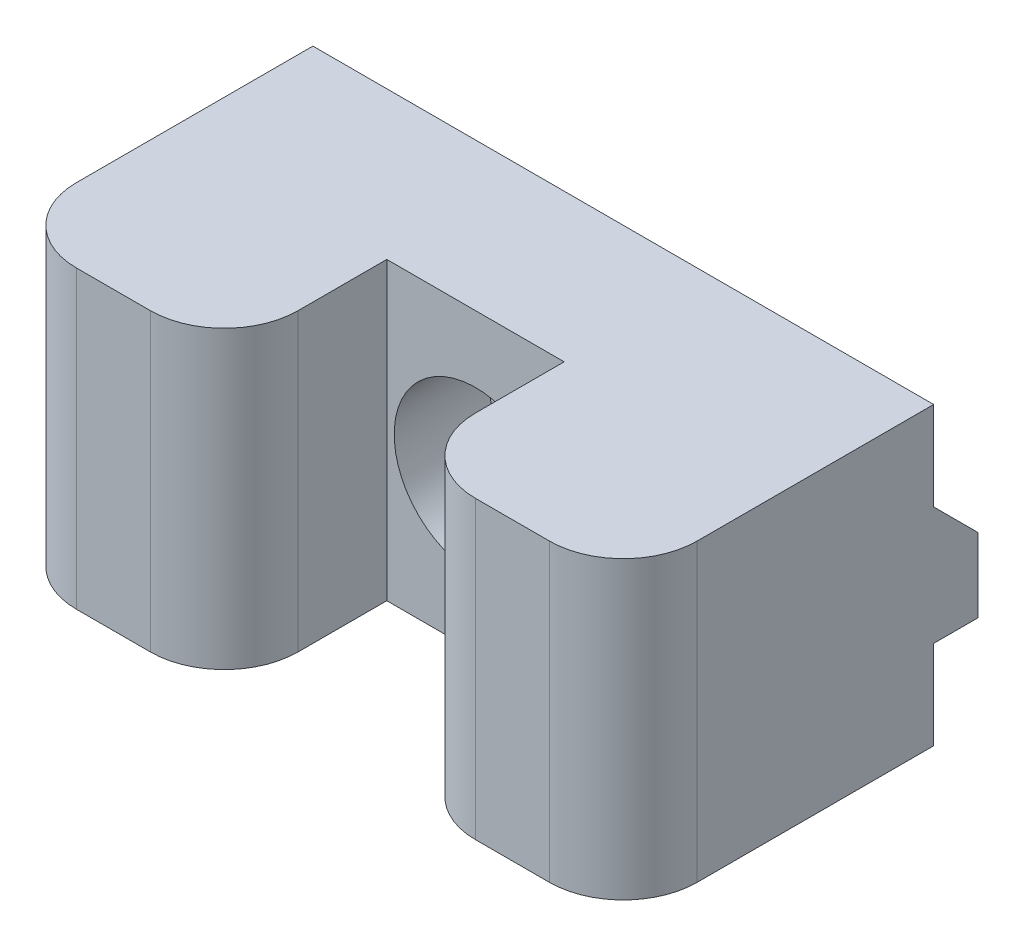
ISO-10303-21;
HEADER;
FILE_DESCRIPTION(('STEP AP214'),'2;1');
FILE_NAME('part.step','',(''),(''),'','','');
FILE_SCHEMA(('AUTOMOTIVE_DESIGN { 1 0 10303 214 1 1 1 1 }'));
ENDSEC;
DATA;
#1=APPLICATION_CONTEXT('core data for automotive mechanical design processes');
#2=APPLICATION_PROTOCOL_DEFINITION('international standard','automotive_design',2000,#1);
#3=PRODUCT_CONTEXT('',#1,'mechanical');
#4=PRODUCT('Part','Part','',(#3));
#5=PRODUCT_RELATED_PRODUCT_CATEGORY('part','',(#4));
#6=PRODUCT_DEFINITION_FORMATION('','',#4);
#7=PRODUCT_DEFINITION_CONTEXT('part definition',#1,'design');
#8=PRODUCT_DEFINITION('design','',#6,#7);
#9=PRODUCT_DEFINITION_SHAPE('','',#8);
#10=(LENGTH_UNIT() NAMED_UNIT(*) SI_UNIT(.MILLI.,.METRE.));
#11=(NAMED_UNIT(*) PLANE_ANGLE_UNIT() SI_UNIT($,.RADIAN.));
#12=(NAMED_UNIT(*) SI_UNIT($,.STERADIAN.) SOLID_ANGLE_UNIT());
#13=UNCERTAINTY_MEASURE_WITH_UNIT(LENGTH_MEASURE(1.E-05),#10,'distance_accuracy_value','');
#14=(GEOMETRIC_REPRESENTATION_CONTEXT(3) GLOBAL_UNCERTAINTY_ASSIGNED_CONTEXT((#13)) GLOBAL_UNIT_ASSIGNED_CONTEXT((#10,
#11,#12)) REPRESENTATION_CONTEXT('',''));
#15=CARTESIAN_POINT('',(0.,0.,0.));
#16=DIRECTION('',(0.,0.,1.));
#17=DIRECTION('',(1.,0.,0.));
#18=AXIS2_PLACEMENT_3D('',#15,#16,#17);
#19=CARTESIAN_POINT('',(0.,0.,0.));
#20=DIRECTION('',(0.,0.,1.));
#21=DIRECTION('',(1.,0.,0.));
#22=AXIS2_PLACEMENT_3D('',#19,#20,#21);
#23=PLANE('',#22);
#24=CARTESIAN_POINT('',(0.,0.,0.));
#25=DIRECTION('',(0.,0.,1.));
#26=DIRECTION('',(1.,0.,0.));
#27=AXIS2_PLACEMENT_3D('',#24,#25,#26);
#28=CIRCLE('',#27,3.3);
#29=CARTESIAN_POINT('',(3.3,0.,0.));
#30=VERTEX_POINT('',#29);
#31=EDGE_CURVE('E240',#30,#30,#28,.T.);
#32=ORIENTED_EDGE('',*,*,#31,.T.);
#33=EDGE_LOOP('',(#32));
#34=FACE_BOUND('',#33,.T.);
#35=DIRECTION('',(-1.,0.,0.));
#36=VECTOR('',#35,1.);
#37=CARTESIAN_POINT('',(0.,-4.,0.));
#38=LINE('',#37,#36);
#39=CARTESIAN_POINT('',(-8.06225774829855,-4.,0.));
#40=VERTEX_POINT('',#39);
#41=CARTESIAN_POINT('',(-21.,-4.,0.));
#42=VERTEX_POINT('',#41);
#43=EDGE_CURVE('E205',#40,#42,#38,.T.);
#44=ORIENTED_EDGE('',*,*,#43,.F.);
#45=CARTESIAN_POINT('',(0.,0.,0.));
#46=DIRECTION('',(0.,0.,-1.));
#47=DIRECTION('',(-1.,0.,0.));
#48=AXIS2_PLACEMENT_3D('',#45,#46,#47);
#49=CIRCLE('',#48,9.);
#50=CARTESIAN_POINT('',(-8.06225774829855,4.,0.));
#51=VERTEX_POINT('',#50);
#52=EDGE_CURVE('E184',#40,#51,#49,.T.);
#53=ORIENTED_EDGE('',*,*,#52,.T.);
#54=DIRECTION('',(-1.,0.,0.));
#55=VECTOR('',#54,1.);
#56=CARTESIAN_POINT('',(0.,4.,0.));
#57=LINE('',#56,#55);
#58=CARTESIAN_POINT('',(-21.,4.,0.));
#59=VERTEX_POINT('',#58);
#60=EDGE_CURVE('E202',#51,#59,#57,.T.);
#61=ORIENTED_EDGE('',*,*,#60,.T.);
#62=DIRECTION('',(0.,-1.,0.));
#63=VECTOR('',#62,1.);
#64=CARTESIAN_POINT('',(-21.,10.,0.));
#65=LINE('',#64,#63);
#66=CARTESIAN_POINT('',(-21.,10.,0.));
#67=VERTEX_POINT('',#66);
#68=EDGE_CURVE('E298',#67,#59,#65,.T.);
#69=ORIENTED_EDGE('',*,*,#68,.F.);
#70=DIRECTION('',(-1.,0.,0.));
#71=VECTOR('',#70,1.);
#72=CARTESIAN_POINT('',(-21.,10.,0.));
#73=LINE('',#72,#71);
#74=CARTESIAN_POINT('',(21.,10.,0.));
#75=VERTEX_POINT('',#74);
#76=EDGE_CURVE('E294',#75,#67,#73,.T.);
#77=ORIENTED_EDGE('',*,*,#76,.F.);
#78=DIRECTION('',(0.,1.,0.));
#79=VECTOR('',#78,1.);
#80=CARTESIAN_POINT('',(21.,10.,0.));
#81=LINE('',#80,#79);
#82=CARTESIAN_POINT('',(21.,4.,0.));
#83=VERTEX_POINT('',#82);
#84=EDGE_CURVE('E283',#83,#75,#81,.T.);
#85=ORIENTED_EDGE('',*,*,#84,.F.);
#86=DIRECTION('',(-1.,0.,0.));
#87=VECTOR('',#86,1.);
#88=CARTESIAN_POINT('',(0.,4.,0.));
#89=LINE('',#88,#87);
#90=CARTESIAN_POINT('',(8.06225774829855,4.,0.));
#91=VERTEX_POINT('',#90);
#92=EDGE_CURVE('E223',#83,#91,#89,.T.);
#93=ORIENTED_EDGE('',*,*,#92,.T.);
#94=CARTESIAN_POINT('',(0.,0.,0.));
#95=DIRECTION('',(0.,0.,-1.));
#96=DIRECTION('',(-1.,0.,0.));
#97=AXIS2_PLACEMENT_3D('',#94,#95,#96);
#98=CIRCLE('',#97,9.);
#99=CARTESIAN_POINT('',(8.06225774829855,-4.,0.));
#100=VERTEX_POINT('',#99);
#101=EDGE_CURVE('E188',#91,#100,#98,.T.);
#102=ORIENTED_EDGE('',*,*,#101,.T.);
#103=DIRECTION('',(-1.,0.,0.));
#104=VECTOR('',#103,1.);
#105=CARTESIAN_POINT('',(0.,-4.,0.));
#106=LINE('',#105,#104);
#107=CARTESIAN_POINT('',(21.,-4.,0.));
#108=VERTEX_POINT('',#107);
#109=EDGE_CURVE('E215',#108,#100,#106,.T.);
#110=ORIENTED_EDGE('',*,*,#109,.F.);
#111=CARTESIAN_POINT('',(21.,-10.,0.));
#112=VERTEX_POINT('',#111);
#113=EDGE_CURVE('E291',#112,#108,#81,.T.);
#114=ORIENTED_EDGE('',*,*,#113,.F.);
#115=DIRECTION('',(1.,0.,0.));
#116=VECTOR('',#115,1.);
#117=CARTESIAN_POINT('',(-21.,-10.,0.));
#118=LINE('',#117,#116);
#119=CARTESIAN_POINT('',(-21.,-10.,0.));
#120=VERTEX_POINT('',#119);
#121=EDGE_CURVE('E288',#120,#112,#118,.T.);
#122=ORIENTED_EDGE('',*,*,#121,.F.);
#123=EDGE_CURVE('E297',#42,#120,#65,.T.);
#124=ORIENTED_EDGE('',*,*,#123,.F.);
#125=EDGE_LOOP('',(#44,#53,#61,#69,#77,#85,#93,#102,#110,#114,#122,#124));
#126=FACE_BOUND('',#125,.T.);
#127=ADVANCED_FACE('F41',(#34,#126),#23,.F.);
#128=CARTESIAN_POINT('',(-21.,-10.,10.));
#129=DIRECTION('',(0.,1.,0.));
#130=DIRECTION('',(0.,0.,1.));
#131=AXIS2_PLACEMENT_3D('',#128,#129,#130);
#132=PLANE('',#131);
#133=DIRECTION('',(0.,0.,-1.));
#134=VECTOR('',#133,1.);
#135=CARTESIAN_POINT('',(21.,-10.,10.));
#136=LINE('',#135,#134);
#137=CARTESIAN_POINT('',(21.,-10.,16.));
#138=VERTEX_POINT('',#137);
#139=EDGE_CURVE('E290',#138,#112,#136,.T.);
#140=ORIENTED_EDGE('',*,*,#139,.F.);
#141=CARTESIAN_POINT('',(16.,-10.,16.));
#142=DIRECTION('',(0.,1.,0.));
#143=DIRECTION('',(0.,0.,1.));
#144=AXIS2_PLACEMENT_3D('',#141,#142,#143);
#145=CIRCLE('',#144,5.);
#146=CARTESIAN_POINT('',(16.,-10.,21.));
#147=VERTEX_POINT('',#146);
#148=EDGE_CURVE('E321',#138,#147,#145,.F.);
#149=ORIENTED_EDGE('',*,*,#148,.T.);
#150=DIRECTION('',(-1.,0.,0.));
#151=VECTOR('',#150,1.);
#152=CARTESIAN_POINT('',(0.,-10.,21.));
#153=LINE('',#152,#151);
#154=CARTESIAN_POINT('',(11.,-10.,21.));
#155=VERTEX_POINT('',#154);
#156=EDGE_CURVE('E247',#147,#155,#153,.T.);
#157=ORIENTED_EDGE('',*,*,#156,.T.);
#158=CARTESIAN_POINT('',(11.,-10.,16.));
#159=DIRECTION('',(0.,1.,0.));
#160=DIRECTION('',(0.,0.,1.));
#161=AXIS2_PLACEMENT_3D('',#158,#159,#160);
#162=CIRCLE('',#161,5.);
#163=CARTESIAN_POINT('',(6.00000000000001,-10.,16.));
#164=VERTEX_POINT('',#163);
#165=EDGE_CURVE('E319',#155,#164,#162,.F.);
#166=ORIENTED_EDGE('',*,*,#165,.T.);
#167=DIRECTION('',(0.,0.,1.));
#168=VECTOR('',#167,1.);
#169=CARTESIAN_POINT('',(6.00000000000001,-10.,0.));
#170=LINE('',#169,#168);
#171=CARTESIAN_POINT('',(6.,-10.,10.));
#172=VERTEX_POINT('',#171);
#173=EDGE_CURVE('E262',#172,#164,#170,.T.);
#174=ORIENTED_EDGE('',*,*,#173,.F.);
#175=DIRECTION('',(1.,0.,0.));
#176=VECTOR('',#175,1.);
#177=CARTESIAN_POINT('',(-21.,-10.,10.));
#178=LINE('',#177,#176);
#179=CARTESIAN_POINT('',(-6.00000000000001,-10.,10.));
#180=VERTEX_POINT('',#179);
#181=EDGE_CURVE('E287',#180,#172,#178,.T.);
#182=ORIENTED_EDGE('',*,*,#181,.F.);
#183=DIRECTION('',(0.,0.,1.));
#184=VECTOR('',#183,1.);
#185=CARTESIAN_POINT('',(-6.00000000000001,-10.,0.));
#186=LINE('',#185,#184);
#187=CARTESIAN_POINT('',(-6.00000000000001,-10.,16.));
#188=VERTEX_POINT('',#187);
#189=EDGE_CURVE('E269',#180,#188,#186,.T.);
#190=ORIENTED_EDGE('',*,*,#189,.T.);
#191=CARTESIAN_POINT('',(-11.,-10.,16.));
#192=DIRECTION('',(0.,1.,0.));
#193=DIRECTION('',(0.,0.,1.));
#194=AXIS2_PLACEMENT_3D('',#191,#192,#193);
#195=CIRCLE('',#194,5.);
#196=CARTESIAN_POINT('',(-11.,-10.,21.));
#197=VERTEX_POINT('',#196);
#198=EDGE_CURVE('E317',#188,#197,#195,.F.);
#199=ORIENTED_EDGE('',*,*,#198,.T.);
#200=DIRECTION('',(1.,0.,0.));
#201=VECTOR('',#200,1.);
#202=CARTESIAN_POINT('',(0.,-10.,21.));
#203=LINE('',#202,#201);
#204=CARTESIAN_POINT('',(-16.,-10.,21.));
#205=VERTEX_POINT('',#204);
#206=EDGE_CURVE('E277',#205,#197,#203,.T.);
#207=ORIENTED_EDGE('',*,*,#206,.F.);
#208=CARTESIAN_POINT('',(-16.,-10.,16.));
#209=DIRECTION('',(0.,1.,0.));
#210=DIRECTION('',(0.,0.,1.));
#211=AXIS2_PLACEMENT_3D('',#208,#209,#210);
#212=CIRCLE('',#211,5.);
#213=CARTESIAN_POINT('',(-21.,-10.,16.));
#214=VERTEX_POINT('',#213);
#215=EDGE_CURVE('E315',#205,#214,#212,.F.);
#216=ORIENTED_EDGE('',*,*,#215,.T.);
#217=DIRECTION('',(0.,0.,-1.));
#218=VECTOR('',#217,1.);
#219=CARTESIAN_POINT('',(-21.,-10.,10.));
#220=LINE('',#219,#218);
#221=EDGE_CURVE('E304',#214,#120,#220,.T.);
#222=ORIENTED_EDGE('',*,*,#221,.T.);
#223=ORIENTED_EDGE('',*,*,#121,.T.);
#224=EDGE_LOOP('',(#140,#149,#157,#166,#174,#182,#190,#199,#207,#216,#222,#223));
#225=FACE_BOUND('',#224,.T.);
#226=CARTESIAN_POINT('',(13.5,-10.,14.));
#227=DIRECTION('',(0.,-1.,0.));
#228=DIRECTION('',(0.,0.,-1.));
#229=AXIS2_PLACEMENT_3D('',#226,#227,#228);
#230=CIRCLE('',#229,5.5);
#231=CARTESIAN_POINT('',(13.5,-10.,8.49999999999997));
#232=VERTEX_POINT('',#231);
#233=EDGE_CURVE('E243',#232,#232,#230,.F.);
#234=ORIENTED_EDGE('',*,*,#233,.T.);
#235=EDGE_LOOP('',(#234));
#236=FACE_BOUND('',#235,.T.);
#237=CARTESIAN_POINT('',(-13.5,-10.,14.));
#238=DIRECTION('',(0.,-1.,0.));
#239=DIRECTION('',(0.,0.,-1.));
#240=AXIS2_PLACEMENT_3D('',#237,#238,#239);
#241=CIRCLE('',#240,5.5);
#242=CARTESIAN_POINT('',(-13.5,-10.,8.5));
#243=VERTEX_POINT('',#242);
#244=EDGE_CURVE('E248',#243,#243,#241,.T.);
#245=ORIENTED_EDGE('',*,*,#244,.F.);
#246=EDGE_LOOP('',(#245));
#247=FACE_BOUND('',#246,.T.);
#248=ADVANCED_FACE('F379',(#225,#236,#247),#132,.F.);
#249=CARTESIAN_POINT('',(0.,0.,10.));
#250=DIRECTION('',(0.,0.,1.));
#251=DIRECTION('',(1.,0.,0.));
#252=AXIS2_PLACEMENT_3D('',#249,#250,#251);
#253=PLANE('',#252);
#254=CARTESIAN_POINT('',(0.,0.,10.));
#255=DIRECTION('',(0.,0.,1.));
#256=DIRECTION('',(1.,0.,0.));
#257=AXIS2_PLACEMENT_3D('',#254,#255,#256);
#258=CIRCLE('',#257,5.5);
#259=CARTESIAN_POINT('',(5.5,0.,10.));
#260=VERTEX_POINT('',#259);
#261=EDGE_CURVE('E231',#260,#260,#258,.T.);
#262=ORIENTED_EDGE('',*,*,#261,.F.);
#263=EDGE_LOOP('',(#262));
#264=FACE_BOUND('',#263,.T.);
#265=ORIENTED_EDGE('',*,*,#181,.T.);
#266=DIRECTION('',(0.,-1.,0.));
#267=VECTOR('',#266,1.);
#268=CARTESIAN_POINT('',(6.00000000000001,28.6010752377383,10.));
#269=LINE('',#268,#267);
#270=CARTESIAN_POINT('',(6.,10.,10.));
#271=VERTEX_POINT('',#270);
#272=EDGE_CURVE('E259',#271,#172,#269,.T.);
#273=ORIENTED_EDGE('',*,*,#272,.F.);
#274=DIRECTION('',(-1.,0.,0.));
#275=VECTOR('',#274,1.);
#276=CARTESIAN_POINT('',(-21.,10.,10.));
#277=LINE('',#276,#275);
#278=CARTESIAN_POINT('',(-6.00000000000001,10.,10.));
#279=VERTEX_POINT('',#278);
#280=EDGE_CURVE('E284',#271,#279,#277,.T.);
#281=ORIENTED_EDGE('',*,*,#280,.T.);
#282=DIRECTION('',(0.,-1.,0.));
#283=VECTOR('',#282,1.);
#284=CARTESIAN_POINT('',(-6.00000000000001,28.6010752377383,10.));
#285=LINE('',#284,#283);
#286=EDGE_CURVE('E274',#279,#180,#285,.T.);
#287=ORIENTED_EDGE('',*,*,#286,.T.);
#288=EDGE_LOOP('',(#265,#273,#281,#287));
#289=FACE_BOUND('',#288,.T.);
#290=ADVANCED_FACE('F397',(#264,#289),#253,.T.);
#291=CARTESIAN_POINT('',(21.,10.,10.));
#292=DIRECTION('',(-1.,0.,0.));
#293=DIRECTION('',(0.,0.,1.));
#294=AXIS2_PLACEMENT_3D('',#291,#292,#293);
#295=PLANE('',#294);
#296=DIRECTION('',(0.,-1.,0.));
#297=VECTOR('',#296,1.);
#298=CARTESIAN_POINT('',(21.,0.,-3.));
#299=LINE('',#298,#297);
#300=CARTESIAN_POINT('',(21.,0.999999999999983,-3.));
#301=VERTEX_POINT('',#300);
#302=CARTESIAN_POINT('',(21.,-4.,-3.));
#303=VERTEX_POINT('',#302);
#304=EDGE_CURVE('E214',#301,#303,#299,.T.);
#305=ORIENTED_EDGE('',*,*,#304,.F.);
#306=DIRECTION('',(0.,-0.707106781186548,-0.707106781186547));
#307=VECTOR('',#306,1.);
#308=CARTESIAN_POINT('',(21.,4.,0.));
#309=LINE('',#308,#307);
#310=EDGE_CURVE('E11',#301,#83,#309,.F.);
#311=ORIENTED_EDGE('',*,*,#310,.T.);
#312=ORIENTED_EDGE('',*,*,#84,.T.);
#313=DIRECTION('',(0.,0.,-1.));
#314=VECTOR('',#313,1.);
#315=CARTESIAN_POINT('',(21.,10.,10.));
#316=LINE('',#315,#314);
#317=CARTESIAN_POINT('',(21.,10.,16.));
#318=VERTEX_POINT('',#317);
#319=EDGE_CURVE('E309',#318,#75,#316,.T.);
#320=ORIENTED_EDGE('',*,*,#319,.F.);
#321=DIRECTION('',(0.,-1.,0.));
#322=VECTOR('',#321,1.);
#323=CARTESIAN_POINT('',(21.,-10.,16.));
#324=LINE('',#323,#322);
#325=EDGE_CURVE('E312',#318,#138,#324,.T.);
#326=ORIENTED_EDGE('',*,*,#325,.T.);
#327=ORIENTED_EDGE('',*,*,#139,.T.);
#328=ORIENTED_EDGE('',*,*,#113,.T.);
#329=DIRECTION('',(0.,0.,1.));
#330=VECTOR('',#329,1.);
#331=CARTESIAN_POINT('',(21.,-4.,-3.));
#332=LINE('',#331,#330);
#333=EDGE_CURVE('E229',#303,#108,#332,.T.);
#334=ORIENTED_EDGE('',*,*,#333,.F.);
#335=EDGE_LOOP('',(#305,#311,#312,#320,#326,#327,#328,#334));
#336=FACE_BOUND('',#335,.T.);
#337=ADVANCED_FACE('F372',(#336),#295,.F.);
#338=CARTESIAN_POINT('',(-21.,10.,10.));
#339=DIRECTION('',(0.,-1.,0.));
#340=DIRECTION('',(0.,0.,-1.));
#341=AXIS2_PLACEMENT_3D('',#338,#339,#340);
#342=PLANE('',#341);
#343=DIRECTION('',(1.,0.,0.));
#344=VECTOR('',#343,1.);
#345=CARTESIAN_POINT('',(0.,10.,21.));
#346=LINE('',#345,#344);
#347=CARTESIAN_POINT('',(11.,10.,21.));
#348=VERTEX_POINT('',#347);
#349=CARTESIAN_POINT('',(16.,10.,21.));
#350=VERTEX_POINT('',#349);
#351=EDGE_CURVE('E258',#348,#350,#346,.T.);
#352=ORIENTED_EDGE('',*,*,#351,.T.);
#353=CARTESIAN_POINT('',(16.,10.,16.));
#354=DIRECTION('',(0.,-1.,0.));
#355=DIRECTION('',(0.,0.,-1.));
#356=AXIS2_PLACEMENT_3D('',#353,#354,#355);
#357=CIRCLE('',#356,5.);
#358=EDGE_CURVE('E334',#350,#318,#357,.F.);
#359=ORIENTED_EDGE('',*,*,#358,.T.);
#360=ORIENTED_EDGE('',*,*,#319,.T.);
#361=ORIENTED_EDGE('',*,*,#76,.T.);
#362=DIRECTION('',(0.,0.,-1.));
#363=VECTOR('',#362,1.);
#364=CARTESIAN_POINT('',(-21.,10.,10.));
#365=LINE('',#364,#363);
#366=CARTESIAN_POINT('',(-21.,10.,16.));
#367=VERTEX_POINT('',#366);
#368=EDGE_CURVE('E307',#367,#67,#365,.T.);
#369=ORIENTED_EDGE('',*,*,#368,.F.);
#370=CARTESIAN_POINT('',(-16.,10.,16.));
#371=DIRECTION('',(0.,-1.,0.));
#372=DIRECTION('',(0.,0.,-1.));
#373=AXIS2_PLACEMENT_3D('',#370,#371,#372);
#374=CIRCLE('',#373,5.);
#375=CARTESIAN_POINT('',(-16.,10.,21.));
#376=VERTEX_POINT('',#375);
#377=EDGE_CURVE('E328',#367,#376,#374,.F.);
#378=ORIENTED_EDGE('',*,*,#377,.T.);
#379=DIRECTION('',(-1.,0.,0.));
#380=VECTOR('',#379,1.);
#381=CARTESIAN_POINT('',(0.,10.,21.));
#382=LINE('',#381,#380);
#383=CARTESIAN_POINT('',(-11.,10.,21.));
#384=VERTEX_POINT('',#383);
#385=EDGE_CURVE('E270',#384,#376,#382,.T.);
#386=ORIENTED_EDGE('',*,*,#385,.F.);
#387=CARTESIAN_POINT('',(-11.,10.,16.));
#388=DIRECTION('',(0.,-1.,0.));
#389=DIRECTION('',(0.,0.,-1.));
#390=AXIS2_PLACEMENT_3D('',#387,#388,#389);
#391=CIRCLE('',#390,5.);
#392=CARTESIAN_POINT('',(-6.00000000000001,10.,16.));
#393=VERTEX_POINT('',#392);
#394=EDGE_CURVE('E330',#384,#393,#391,.F.);
#395=ORIENTED_EDGE('',*,*,#394,.T.);
#396=DIRECTION('',(0.,0.,-1.));
#397=VECTOR('',#396,1.);
#398=CARTESIAN_POINT('',(-6.00000000000001,10.,0.));
#399=LINE('',#398,#397);
#400=EDGE_CURVE('E273',#393,#279,#399,.T.);
#401=ORIENTED_EDGE('',*,*,#400,.T.);
#402=ORIENTED_EDGE('',*,*,#280,.F.);
#403=DIRECTION('',(0.,0.,-1.));
#404=VECTOR('',#403,1.);
#405=CARTESIAN_POINT('',(6.00000000000001,10.,0.));
#406=LINE('',#405,#404);
#407=CARTESIAN_POINT('',(6.00000000000001,10.,16.));
#408=VERTEX_POINT('',#407);
#409=EDGE_CURVE('E256',#408,#271,#406,.T.);
#410=ORIENTED_EDGE('',*,*,#409,.F.);
#411=CARTESIAN_POINT('',(11.,10.,16.));
#412=DIRECTION('',(0.,-1.,0.));
#413=DIRECTION('',(0.,0.,-1.));
#414=AXIS2_PLACEMENT_3D('',#411,#412,#413);
#415=CIRCLE('',#414,5.);
#416=EDGE_CURVE('E332',#408,#348,#415,.F.);
#417=ORIENTED_EDGE('',*,*,#416,.T.);
#418=EDGE_LOOP('',(#352,#359,#360,#361,#369,#378,#386,#395,#401,#402,#410,#417));
#419=FACE_BOUND('',#418,.T.);
#420=ADVANCED_FACE('F366',(#419),#342,.F.);
#421=CARTESIAN_POINT('',(-21.,10.,10.));
#422=DIRECTION('',(1.,0.,0.));
#423=DIRECTION('',(0.,0.,-1.));
#424=AXIS2_PLACEMENT_3D('',#421,#422,#423);
#425=PLANE('',#424);
#426=ORIENTED_EDGE('',*,*,#68,.T.);
#427=DIRECTION('',(0.,0.707106781186548,0.707106781186547));
#428=VECTOR('',#427,1.);
#429=CARTESIAN_POINT('',(-21.,4.,0.));
#430=LINE('',#429,#428);
#431=CARTESIAN_POINT('',(-21.,0.999999999999983,-3.));
#432=VERTEX_POINT('',#431);
#433=EDGE_CURVE('E348',#59,#432,#430,.F.);
#434=ORIENTED_EDGE('',*,*,#433,.T.);
#435=DIRECTION('',(0.,1.,0.));
#436=VECTOR('',#435,1.);
#437=CARTESIAN_POINT('',(-21.,0.,-3.));
#438=LINE('',#437,#436);
#439=CARTESIAN_POINT('',(-21.,-4.,-3.));
#440=VERTEX_POINT('',#439);
#441=EDGE_CURVE('E197',#440,#432,#438,.T.);
#442=ORIENTED_EDGE('',*,*,#441,.F.);
#443=DIRECTION('',(0.,0.,1.));
#444=VECTOR('',#443,1.);
#445=CARTESIAN_POINT('',(-21.,-4.,-3.));
#446=LINE('',#445,#444);
#447=EDGE_CURVE('E189',#440,#42,#446,.T.);
#448=ORIENTED_EDGE('',*,*,#447,.T.);
#449=ORIENTED_EDGE('',*,*,#123,.T.);
#450=ORIENTED_EDGE('',*,*,#221,.F.);
#451=DIRECTION('',(0.,-1.,0.));
#452=VECTOR('',#451,1.);
#453=CARTESIAN_POINT('',(-21.,10.,16.));
#454=LINE('',#453,#452);
#455=EDGE_CURVE('E346',#214,#367,#454,.F.);
#456=ORIENTED_EDGE('',*,*,#455,.T.);
#457=ORIENTED_EDGE('',*,*,#368,.T.);
#458=EDGE_LOOP('',(#426,#434,#442,#448,#449,#450,#456,#457));
#459=FACE_BOUND('',#458,.T.);
#460=ADVANCED_FACE('F360',(#459),#425,.F.);
#461=CARTESIAN_POINT('',(0.,28.6010752377383,21.));
#462=DIRECTION('',(0.,0.,-1.));
#463=DIRECTION('',(-1.,0.,0.));
#464=AXIS2_PLACEMENT_3D('',#461,#462,#463);
#465=PLANE('',#464);
#466=ORIENTED_EDGE('',*,*,#206,.T.);
#467=DIRECTION('',(0.,-1.,0.));
#468=VECTOR('',#467,1.);
#469=CARTESIAN_POINT('',(-11.,10.,21.));
#470=LINE('',#469,#468);
#471=EDGE_CURVE('E344',#197,#384,#470,.F.);
#472=ORIENTED_EDGE('',*,*,#471,.T.);
#473=ORIENTED_EDGE('',*,*,#385,.T.);
#474=DIRECTION('',(0.,-1.,0.));
#475=VECTOR('',#474,1.);
#476=CARTESIAN_POINT('',(-16.,28.6010752377383,21.));
#477=LINE('',#476,#475);
#478=EDGE_CURVE('E341',#376,#205,#477,.T.);
#479=ORIENTED_EDGE('',*,*,#478,.T.);
#480=EDGE_LOOP('',(#466,#472,#473,#479));
#481=FACE_BOUND('',#480,.T.);
#482=ADVANCED_FACE('F410',(#481),#465,.F.);
#483=CARTESIAN_POINT('',(-6.00000000000001,28.6010752377383,0.));
#484=DIRECTION('',(1.,0.,0.));
#485=DIRECTION('',(0.,0.,-1.));
#486=AXIS2_PLACEMENT_3D('',#483,#484,#485);
#487=PLANE('',#486);
#488=ORIENTED_EDGE('',*,*,#400,.F.);
#489=DIRECTION('',(0.,-1.,0.));
#490=VECTOR('',#489,1.);
#491=CARTESIAN_POINT('',(-6.00000000000001,-10.,16.));
#492=LINE('',#491,#490);
#493=EDGE_CURVE('E338',#393,#188,#492,.T.);
#494=ORIENTED_EDGE('',*,*,#493,.T.);
#495=ORIENTED_EDGE('',*,*,#189,.F.);
#496=ORIENTED_EDGE('',*,*,#286,.F.);
#497=EDGE_LOOP('',(#488,#494,#495,#496));
#498=FACE_BOUND('',#497,.T.);
#499=ADVANCED_FACE('F404',(#498),#487,.T.);
#500=CARTESIAN_POINT('',(6.00000000000001,28.6010752377383,0.));
#501=DIRECTION('',(1.,0.,0.));
#502=DIRECTION('',(0.,0.,-1.));
#503=AXIS2_PLACEMENT_3D('',#500,#501,#502);
#504=PLANE('',#503);
#505=ORIENTED_EDGE('',*,*,#173,.T.);
#506=DIRECTION('',(0.,-1.,0.));
#507=VECTOR('',#506,1.);
#508=CARTESIAN_POINT('',(6.00000000000001,10.,16.));
#509=LINE('',#508,#507);
#510=EDGE_CURVE('E336',#164,#408,#509,.F.);
#511=ORIENTED_EDGE('',*,*,#510,.T.);
#512=ORIENTED_EDGE('',*,*,#409,.T.);
#513=ORIENTED_EDGE('',*,*,#272,.T.);
#514=EDGE_LOOP('',(#505,#511,#512,#513));
#515=FACE_BOUND('',#514,.T.);
#516=ADVANCED_FACE('F392',(#515),#504,.F.);
#517=CARTESIAN_POINT('',(0.,28.6010752377383,21.));
#518=DIRECTION('',(0.,0.,1.));
#519=DIRECTION('',(1.,0.,0.));
#520=AXIS2_PLACEMENT_3D('',#517,#518,#519);
#521=PLANE('',#520);
#522=ORIENTED_EDGE('',*,*,#156,.F.);
#523=DIRECTION('',(0.,-1.,0.));
#524=VECTOR('',#523,1.);
#525=CARTESIAN_POINT('',(16.,10.,21.));
#526=LINE('',#525,#524);
#527=EDGE_CURVE('E326',#147,#350,#526,.F.);
#528=ORIENTED_EDGE('',*,*,#527,.T.);
#529=ORIENTED_EDGE('',*,*,#351,.F.);
#530=DIRECTION('',(0.,-1.,0.));
#531=VECTOR('',#530,1.);
#532=CARTESIAN_POINT('',(11.,-10.,21.));
#533=LINE('',#532,#531);
#534=EDGE_CURVE('E323',#348,#155,#533,.T.);
#535=ORIENTED_EDGE('',*,*,#534,.T.);
#536=EDGE_LOOP('',(#522,#528,#529,#535));
#537=FACE_BOUND('',#536,.T.);
#538=ADVANCED_FACE('F382',(#537),#521,.T.);
#539=CARTESIAN_POINT('',(13.5,-5.,14.));
#540=DIRECTION('',(0.,-1.,0.));
#541=DIRECTION('',(0.,0.,-1.));
#542=AXIS2_PLACEMENT_3D('',#539,#540,#541);
#543=CYLINDRICAL_SURFACE('',#542,5.5);
#544=CARTESIAN_POINT('',(13.5,-5.,14.));
#545=DIRECTION('',(0.,-1.,0.));
#546=DIRECTION('',(0.,0.,-1.));
#547=AXIS2_PLACEMENT_3D('',#544,#545,#546);
#548=CIRCLE('',#547,5.5);
#549=CARTESIAN_POINT('',(13.5,-5.,8.49999999999997));
#550=VERTEX_POINT('',#549);
#551=EDGE_CURVE('E251',#550,#550,#548,.F.);
#552=ORIENTED_EDGE('',*,*,#551,.T.);
#553=EDGE_LOOP('',(#552));
#554=FACE_BOUND('',#553,.T.);
#555=ORIENTED_EDGE('',*,*,#233,.F.);
#556=EDGE_LOOP('',(#555));
#557=FACE_BOUND('',#556,.T.);
#558=ADVANCED_FACE('F616',(#554,#557),#543,.F.);
#559=CARTESIAN_POINT('',(0.,-5.,0.));
#560=DIRECTION('',(0.,-1.,0.));
#561=DIRECTION('',(0.,0.,-1.));
#562=AXIS2_PLACEMENT_3D('',#559,#560,#561);
#563=PLANE('',#562);
#564=ORIENTED_EDGE('',*,*,#551,.F.);
#565=EDGE_LOOP('',(#564));
#566=FACE_BOUND('',#565,.T.);
#567=ADVANCED_FACE('F606',(#566),#563,.T.);
#568=CARTESIAN_POINT('',(-13.5,-5.,14.));
#569=DIRECTION('',(0.,-1.,0.));
#570=DIRECTION('',(0.,0.,-1.));
#571=AXIS2_PLACEMENT_3D('',#568,#569,#570);
#572=CYLINDRICAL_SURFACE('',#571,5.5);
#573=CARTESIAN_POINT('',(-13.5,-5.,14.));
#574=DIRECTION('',(0.,-1.,0.));
#575=DIRECTION('',(0.,0.,-1.));
#576=AXIS2_PLACEMENT_3D('',#573,#574,#575);
#577=CIRCLE('',#576,5.5);
#578=CARTESIAN_POINT('',(-13.5,-5.,8.5));
#579=VERTEX_POINT('',#578);
#580=EDGE_CURVE('E244',#579,#579,#577,.T.);
#581=ORIENTED_EDGE('',*,*,#580,.F.);
#582=EDGE_LOOP('',(#581));
#583=FACE_BOUND('',#582,.T.);
#584=ORIENTED_EDGE('',*,*,#244,.T.);
#585=EDGE_LOOP('',(#584));
#586=FACE_BOUND('',#585,.T.);
#587=ADVANCED_FACE('F596',(#583,#586),#572,.F.);
#588=CARTESIAN_POINT('',(0.,-5.,0.));
#589=DIRECTION('',(0.,-1.,0.));
#590=DIRECTION('',(0.,0.,-1.));
#591=AXIS2_PLACEMENT_3D('',#588,#589,#590);
#592=PLANE('',#591);
#593=ORIENTED_EDGE('',*,*,#580,.T.);
#594=EDGE_LOOP('',(#593));
#595=FACE_BOUND('',#594,.T.);
#596=ADVANCED_FACE('F586',(#595),#592,.T.);
#597=CARTESIAN_POINT('',(0.,0.,10.));
#598=DIRECTION('',(0.,0.,1.));
#599=DIRECTION('',(1.,0.,0.));
#600=AXIS2_PLACEMENT_3D('',#597,#598,#599);
#601=CYLINDRICAL_SURFACE('',#600,3.3);
#602=ORIENTED_EDGE('',*,*,#31,.F.);
#603=EDGE_LOOP('',(#602));
#604=FACE_BOUND('',#603,.T.);
#605=CARTESIAN_POINT('',(0.,0.,3.6));
#606=DIRECTION('',(0.,0.,1.));
#607=DIRECTION('',(1.,0.,0.));
#608=AXIS2_PLACEMENT_3D('',#605,#606,#607);
#609=CIRCLE('',#608,3.3);
#610=CARTESIAN_POINT('',(3.3,0.,3.6));
#611=VERTEX_POINT('',#610);
#612=EDGE_CURVE('E237',#611,#611,#609,.T.);
#613=ORIENTED_EDGE('',*,*,#612,.T.);
#614=EDGE_LOOP('',(#613));
#615=FACE_BOUND('',#614,.T.);
#616=ADVANCED_FACE('F576',(#604,#615),#601,.F.);
#617=CARTESIAN_POINT('',(3.3,0.,3.6));
#618=DIRECTION('',(0.,0.,-1.));
#619=DIRECTION('',(-1.,0.,0.));
#620=AXIS2_PLACEMENT_3D('',#617,#618,#619);
#621=PLANE('',#620);
#622=ORIENTED_EDGE('',*,*,#612,.F.);
#623=EDGE_LOOP('',(#622));
#624=FACE_BOUND('',#623,.T.);
#625=CARTESIAN_POINT('',(0.,0.,3.6));
#626=DIRECTION('',(0.,0.,1.));
#627=DIRECTION('',(1.,0.,0.));
#628=AXIS2_PLACEMENT_3D('',#625,#626,#627);
#629=CIRCLE('',#628,5.5);
#630=CARTESIAN_POINT('',(5.5,0.,3.6));
#631=VERTEX_POINT('',#630);
#632=EDGE_CURVE('E234',#631,#631,#629,.T.);
#633=ORIENTED_EDGE('',*,*,#632,.T.);
#634=EDGE_LOOP('',(#633));
#635=FACE_BOUND('',#634,.T.);
#636=ADVANCED_FACE('F567',(#624,#635),#621,.F.);
#637=CARTESIAN_POINT('',(0.,0.,10.));
#638=DIRECTION('',(0.,0.,1.));
#639=DIRECTION('',(1.,0.,0.));
#640=AXIS2_PLACEMENT_3D('',#637,#638,#639);
#641=CYLINDRICAL_SURFACE('',#640,5.5);
#642=ORIENTED_EDGE('',*,*,#632,.F.);
#643=EDGE_LOOP('',(#642));
#644=FACE_BOUND('',#643,.T.);
#645=ORIENTED_EDGE('',*,*,#261,.T.);
#646=EDGE_LOOP('',(#645));
#647=FACE_BOUND('',#646,.T.);
#648=ADVANCED_FACE('F457',(#644,#647),#641,.F.);
#649=CARTESIAN_POINT('',(16.,10.,16.));
#650=DIRECTION('',(0.,1.,0.));
#651=DIRECTION('',(0.,0.,1.));
#652=AXIS2_PLACEMENT_3D('',#649,#650,#651);
#653=CYLINDRICAL_SURFACE('',#652,5.);
#654=ORIENTED_EDGE('',*,*,#358,.F.);
#655=ORIENTED_EDGE('',*,*,#527,.F.);
#656=ORIENTED_EDGE('',*,*,#148,.F.);
#657=ORIENTED_EDGE('',*,*,#325,.F.);
#658=EDGE_LOOP('',(#654,#655,#656,#657));
#659=FACE_BOUND('',#658,.T.);
#660=ADVANCED_FACE('F375',(#659),#653,.T.);
#661=CARTESIAN_POINT('',(11.,28.6010752377383,16.));
#662=DIRECTION('',(0.,1.,0.));
#663=DIRECTION('',(0.,0.,1.));
#664=AXIS2_PLACEMENT_3D('',#661,#662,#663);
#665=CYLINDRICAL_SURFACE('',#664,5.);
#666=ORIENTED_EDGE('',*,*,#416,.F.);
#667=ORIENTED_EDGE('',*,*,#510,.F.);
#668=ORIENTED_EDGE('',*,*,#165,.F.);
#669=ORIENTED_EDGE('',*,*,#534,.F.);
#670=EDGE_LOOP('',(#666,#667,#668,#669));
#671=FACE_BOUND('',#670,.T.);
#672=ADVANCED_FACE('F387',(#671),#665,.T.);
#673=CARTESIAN_POINT('',(-11.,28.6010752377383,16.));
#674=DIRECTION('',(0.,1.,0.));
#675=DIRECTION('',(0.,0.,1.));
#676=AXIS2_PLACEMENT_3D('',#673,#674,#675);
#677=CYLINDRICAL_SURFACE('',#676,5.);
#678=ORIENTED_EDGE('',*,*,#394,.F.);
#679=ORIENTED_EDGE('',*,*,#471,.F.);
#680=ORIENTED_EDGE('',*,*,#198,.F.);
#681=ORIENTED_EDGE('',*,*,#493,.F.);
#682=EDGE_LOOP('',(#678,#679,#680,#681));
#683=FACE_BOUND('',#682,.T.);
#684=ADVANCED_FACE('F406',(#683),#677,.T.);
#685=CARTESIAN_POINT('',(-16.,28.6010752377383,16.));
#686=DIRECTION('',(0.,-1.,0.));
#687=DIRECTION('',(0.,0.,-1.));
#688=AXIS2_PLACEMENT_3D('',#685,#686,#687);
#689=CYLINDRICAL_SURFACE('',#688,5.);
#690=ORIENTED_EDGE('',*,*,#377,.F.);
#691=ORIENTED_EDGE('',*,*,#455,.F.);
#692=ORIENTED_EDGE('',*,*,#215,.F.);
#693=ORIENTED_EDGE('',*,*,#478,.F.);
#694=EDGE_LOOP('',(#690,#691,#692,#693));
#695=FACE_BOUND('',#694,.T.);
#696=ADVANCED_FACE('F413',(#695),#689,.T.);
#697=CARTESIAN_POINT('',(0.,0.,-3.));
#698=DIRECTION('',(0.,0.,1.));
#699=DIRECTION('',(1.,0.,0.));
#700=AXIS2_PLACEMENT_3D('',#697,#698,#699);
#701=CYLINDRICAL_SURFACE('',#700,9.);
#702=ORIENTED_EDGE('',*,*,#101,.F.);
#703=CARTESIAN_POINT('',(0.,0.,-3.99999999999998));
#704=DIRECTION('',(0.,-0.707106781186547,0.707106781186548));
#705=DIRECTION('',(0.,0.707106781186548,0.707106781186547));
#706=AXIS2_PLACEMENT_3D('',#703,#704,#705);
#707=ELLIPSE('',#706,12.7279220613578,9.);
#708=CARTESIAN_POINT('',(8.94427190999916,0.999999999999983,-3.));
#709=VERTEX_POINT('',#708);
#710=EDGE_CURVE('E64',#91,#709,#707,.F.);
#711=ORIENTED_EDGE('',*,*,#710,.T.);
#712=CARTESIAN_POINT('',(0.,0.,-3.));
#713=DIRECTION('',(0.,0.,-1.));
#714=DIRECTION('',(-1.,0.,0.));
#715=AXIS2_PLACEMENT_3D('',#712,#713,#714);
#716=CIRCLE('',#715,9.);
#717=CARTESIAN_POINT('',(8.06225774829855,-4.,-3.));
#718=VERTEX_POINT('',#717);
#719=EDGE_CURVE('E212',#709,#718,#716,.T.);
#720=ORIENTED_EDGE('',*,*,#719,.T.);
#721=DIRECTION('',(0.,0.,1.));
#722=VECTOR('',#721,1.);
#723=CARTESIAN_POINT('',(8.06225774829855,-4.,-3.));
#724=LINE('',#723,#722);
#725=EDGE_CURVE('E220',#718,#100,#724,.T.);
#726=ORIENTED_EDGE('',*,*,#725,.T.);
#727=EDGE_LOOP('',(#702,#711,#720,#726));
#728=FACE_BOUND('',#727,.T.);
#729=ADVANCED_FACE('F427',(#728),#701,.F.);
#730=CARTESIAN_POINT('',(0.,-4.,-3.));
#731=DIRECTION('',(0.,1.,0.));
#732=DIRECTION('',(0.,0.,1.));
#733=AXIS2_PLACEMENT_3D('',#730,#731,#732);
#734=PLANE('',#733);
#735=ORIENTED_EDGE('',*,*,#109,.T.);
#736=ORIENTED_EDGE('',*,*,#725,.F.);
#737=DIRECTION('',(-1.,0.,0.));
#738=VECTOR('',#737,1.);
#739=CARTESIAN_POINT('',(0.,-4.,-3.));
#740=LINE('',#739,#738);
#741=EDGE_CURVE('E217',#303,#718,#740,.T.);
#742=ORIENTED_EDGE('',*,*,#741,.F.);
#743=ORIENTED_EDGE('',*,*,#333,.T.);
#744=EDGE_LOOP('',(#735,#736,#742,#743));
#745=FACE_BOUND('',#744,.T.);
#746=ADVANCED_FACE('F424',(#745),#734,.F.);
#747=CARTESIAN_POINT('',(0.,0.,-3.));
#748=DIRECTION('',(0.,0.,-1.));
#749=DIRECTION('',(-1.,0.,0.));
#750=AXIS2_PLACEMENT_3D('',#747,#748,#749);
#751=PLANE('',#750);
#752=ORIENTED_EDGE('',*,*,#719,.F.);
#753=DIRECTION('',(1.,0.,0.));
#754=VECTOR('',#753,1.);
#755=CARTESIAN_POINT('',(0.,0.999999999999983,-3.));
#756=LINE('',#755,#754);
#757=EDGE_CURVE('E50',#709,#301,#756,.T.);
#758=ORIENTED_EDGE('',*,*,#757,.T.);
#759=ORIENTED_EDGE('',*,*,#304,.T.);
#760=ORIENTED_EDGE('',*,*,#741,.T.);
#761=EDGE_LOOP('',(#752,#758,#759,#760));
#762=FACE_BOUND('',#761,.T.);
#763=ADVANCED_FACE('F425',(#762),#751,.T.);
#764=CARTESIAN_POINT('',(0.,0.,-3.));
#765=DIRECTION('',(0.,0.,1.));
#766=DIRECTION('',(1.,0.,0.));
#767=AXIS2_PLACEMENT_3D('',#764,#765,#766);
#768=CYLINDRICAL_SURFACE('',#767,9.);
#769=CARTESIAN_POINT('',(0.,0.,-3.));
#770=DIRECTION('',(0.,0.,-1.));
#771=DIRECTION('',(-1.,0.,0.));
#772=AXIS2_PLACEMENT_3D('',#769,#770,#771);
#773=CIRCLE('',#772,9.);
#774=CARTESIAN_POINT('',(-8.06225774829855,-4.,-3.));
#775=VERTEX_POINT('',#774);
#776=CARTESIAN_POINT('',(-8.94427190999916,0.999999999999983,-3.));
#777=VERTEX_POINT('',#776);
#778=EDGE_CURVE('E181',#775,#777,#773,.T.);
#779=ORIENTED_EDGE('',*,*,#778,.T.);
#780=CARTESIAN_POINT('',(0.,0.,-3.99999999999998));
#781=DIRECTION('',(0.,-0.707106781186547,0.707106781186548));
#782=DIRECTION('',(0.,0.707106781186548,0.707106781186547));
#783=AXIS2_PLACEMENT_3D('',#780,#781,#782);
#784=ELLIPSE('',#783,12.7279220613578,9.);
#785=EDGE_CURVE('E351',#777,#51,#784,.F.);
#786=ORIENTED_EDGE('',*,*,#785,.T.);
#787=ORIENTED_EDGE('',*,*,#52,.F.);
#788=DIRECTION('',(0.,0.,1.));
#789=VECTOR('',#788,1.);
#790=CARTESIAN_POINT('',(-8.06225774829855,-4.,-3.));
#791=LINE('',#790,#789);
#792=EDGE_CURVE('E177',#775,#40,#791,.T.);
#793=ORIENTED_EDGE('',*,*,#792,.F.);
#794=EDGE_LOOP('',(#779,#786,#787,#793));
#795=FACE_BOUND('',#794,.T.);
#796=ADVANCED_FACE('F179',(#795),#768,.F.);
#797=CARTESIAN_POINT('',(0.,-4.,-3.));
#798=DIRECTION('',(0.,1.,0.));
#799=DIRECTION('',(0.,0.,1.));
#800=AXIS2_PLACEMENT_3D('',#797,#798,#799);
#801=PLANE('',#800);
#802=ORIENTED_EDGE('',*,*,#43,.T.);
#803=ORIENTED_EDGE('',*,*,#447,.F.);
#804=DIRECTION('',(-1.,0.,0.));
#805=VECTOR('',#804,1.);
#806=CARTESIAN_POINT('',(0.,-4.,-3.));
#807=LINE('',#806,#805);
#808=EDGE_CURVE('E192',#775,#440,#807,.T.);
#809=ORIENTED_EDGE('',*,*,#808,.F.);
#810=ORIENTED_EDGE('',*,*,#792,.T.);
#811=EDGE_LOOP('',(#802,#803,#809,#810));
#812=FACE_BOUND('',#811,.T.);
#813=ADVANCED_FACE('F193',(#812),#801,.F.);
#814=CARTESIAN_POINT('',(0.,0.,-3.));
#815=DIRECTION('',(0.,0.,-1.));
#816=DIRECTION('',(-1.,0.,0.));
#817=AXIS2_PLACEMENT_3D('',#814,#815,#816);
#818=PLANE('',#817);
#819=ORIENTED_EDGE('',*,*,#441,.T.);
#820=DIRECTION('',(1.,0.,0.));
#821=VECTOR('',#820,1.);
#822=CARTESIAN_POINT('',(0.,0.999999999999983,-3.));
#823=LINE('',#822,#821);
#824=EDGE_CURVE('E201',#432,#777,#823,.T.);
#825=ORIENTED_EDGE('',*,*,#824,.T.);
#826=ORIENTED_EDGE('',*,*,#778,.F.);
#827=ORIENTED_EDGE('',*,*,#808,.T.);
#828=EDGE_LOOP('',(#819,#825,#826,#827));
#829=FACE_BOUND('',#828,.T.);
#830=ADVANCED_FACE('F199',(#829),#818,.T.);
#831=CARTESIAN_POINT('',(0.,4.,0.));
#832=DIRECTION('',(0.,-0.707106781186547,0.707106781186548));
#833=DIRECTION('',(-1.,0.,0.));
#834=AXIS2_PLACEMENT_3D('',#831,#832,#833);
#835=PLANE('',#834);
#836=ORIENTED_EDGE('',*,*,#785,.F.);
#837=ORIENTED_EDGE('',*,*,#824,.F.);
#838=ORIENTED_EDGE('',*,*,#433,.F.);
#839=ORIENTED_EDGE('',*,*,#60,.F.);
#840=EDGE_LOOP('',(#836,#837,#838,#839));
#841=FACE_BOUND('',#840,.T.);
#842=ADVANCED_FACE('F358',(#841),#835,.F.);
#843=CARTESIAN_POINT('',(0.,4.,0.));
#844=DIRECTION('',(0.,-0.707106781186547,0.707106781186548));
#845=DIRECTION('',(-1.,0.,0.));
#846=AXIS2_PLACEMENT_3D('',#843,#844,#845);
#847=PLANE('',#846);
#848=ORIENTED_EDGE('',*,*,#310,.F.);
#849=ORIENTED_EDGE('',*,*,#757,.F.);
#850=ORIENTED_EDGE('',*,*,#710,.F.);
#851=ORIENTED_EDGE('',*,*,#92,.F.);
#852=EDGE_LOOP('',(#848,#849,#850,#851));
#853=FACE_BOUND('',#852,.T.);
#854=ADVANCED_FACE('F44',(#853),#847,.F.);
#855=CLOSED_SHELL('',(#127,#248,#290,#337,#420,#460,#482,#499,#516,#538,#558,#567,#587,#596,
#616,#636,#648,#660,#672,#684,#696,#729,#746,#763,#796,#813,#830,#842,#854));
#856=MANIFOLD_SOLID_BREP('B2',#855);
#857=ADVANCED_BREP_SHAPE_REPRESENTATION('',(#18,#856),#14);
#858=SHAPE_DEFINITION_REPRESENTATION(#9,#857);
ENDSEC;
END-ISO-10303-21;
